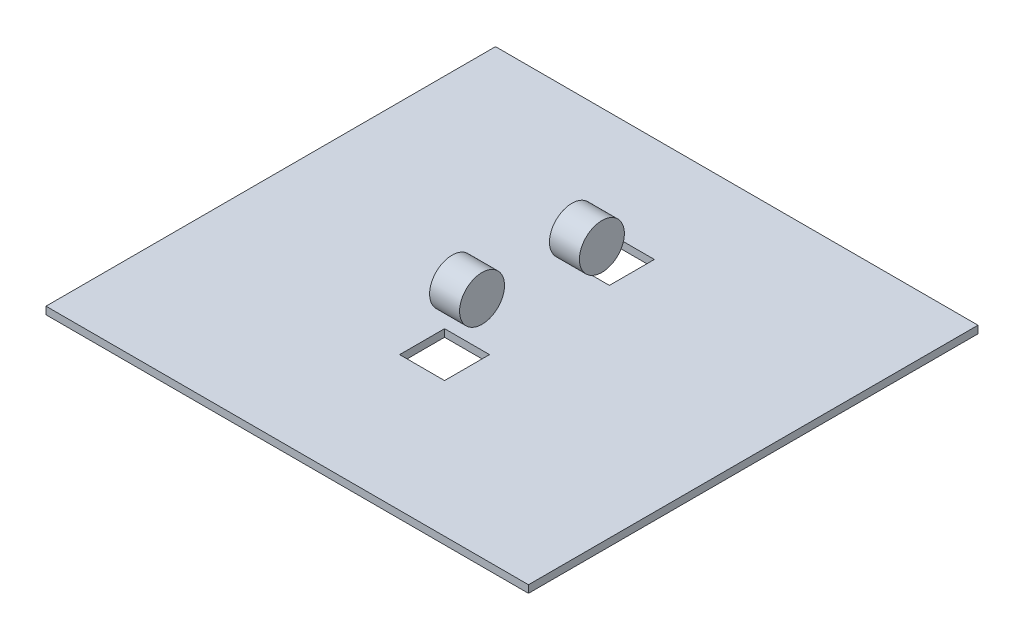
ISO-10303-21;
HEADER;
FILE_DESCRIPTION(('STEP AP214'),'2;1');
FILE_NAME('part.step','',(''),(''),'','','');
FILE_SCHEMA(('AUTOMOTIVE_DESIGN { 1 0 10303 214 1 1 1 1 }'));
ENDSEC;
DATA;
#1=APPLICATION_CONTEXT('core data for automotive mechanical design processes');
#2=APPLICATION_PROTOCOL_DEFINITION('international standard','automotive_design',2000,#1);
#3=PRODUCT_CONTEXT('',#1,'mechanical');
#4=PRODUCT('Part','Part','',(#3));
#5=PRODUCT_RELATED_PRODUCT_CATEGORY('part','',(#4));
#6=PRODUCT_DEFINITION_FORMATION('','',#4);
#7=PRODUCT_DEFINITION_CONTEXT('part definition',#1,'design');
#8=PRODUCT_DEFINITION('design','',#6,#7);
#9=PRODUCT_DEFINITION_SHAPE('','',#8);
#10=(LENGTH_UNIT() NAMED_UNIT(*) SI_UNIT(.MILLI.,.METRE.));
#11=(NAMED_UNIT(*) PLANE_ANGLE_UNIT() SI_UNIT($,.RADIAN.));
#12=(NAMED_UNIT(*) SI_UNIT($,.STERADIAN.) SOLID_ANGLE_UNIT());
#13=UNCERTAINTY_MEASURE_WITH_UNIT(LENGTH_MEASURE(1.E-05),#10,'distance_accuracy_value','');
#14=(GEOMETRIC_REPRESENTATION_CONTEXT(3) GLOBAL_UNCERTAINTY_ASSIGNED_CONTEXT((#13)) GLOBAL_UNIT_ASSIGNED_CONTEXT((#10,
#11,#12)) REPRESENTATION_CONTEXT('',''));
#15=CARTESIAN_POINT('',(0.,0.,0.));
#16=DIRECTION('',(0.,0.,1.));
#17=DIRECTION('',(1.,0.,0.));
#18=AXIS2_PLACEMENT_3D('',#15,#16,#17);
#19=CARTESIAN_POINT('',(171.,25.,-200.));
#20=DIRECTION('',(-1.,0.,0.));
#21=DIRECTION('',(0.,0.,1.));
#22=AXIS2_PLACEMENT_3D('',#19,#20,#21);
#23=CYLINDRICAL_SURFACE('',#22,15.);
#24=CARTESIAN_POINT('',(171.,25.,-200.));
#25=DIRECTION('',(1.,0.,0.));
#26=DIRECTION('',(0.,0.,-1.));
#27=AXIS2_PLACEMENT_3D('',#24,#25,#26);
#28=CIRCLE('',#27,15.);
#29=CARTESIAN_POINT('',(171.,25.,-215.));
#30=VERTEX_POINT('',#29);
#31=EDGE_CURVE('E11',#30,#30,#28,.T.);
#32=ORIENTED_EDGE('',*,*,#31,.F.);
#33=EDGE_LOOP('',(#32));
#34=FACE_BOUND('',#33,.T.);
#35=CARTESIAN_POINT('',(151.,25.,-200.));
#36=DIRECTION('',(1.,0.,0.));
#37=DIRECTION('',(0.,0.,-1.));
#38=AXIS2_PLACEMENT_3D('',#35,#36,#37);
#39=CIRCLE('',#38,15.);
#40=CARTESIAN_POINT('',(151.,25.,-215.));
#41=VERTEX_POINT('',#40);
#42=EDGE_CURVE('E49',#41,#41,#39,.T.);
#43=ORIENTED_EDGE('',*,*,#42,.T.);
#44=EDGE_LOOP('',(#43));
#45=FACE_BOUND('',#44,.T.);
#46=ADVANCED_FACE('F46',(#34,#45),#23,.T.);
#47=CARTESIAN_POINT('',(171.,25.,-200.));
#48=DIRECTION('',(1.,0.,0.));
#49=DIRECTION('',(0.,0.,-1.));
#50=AXIS2_PLACEMENT_3D('',#47,#48,#49);
#51=PLANE('',#50);
#52=ORIENTED_EDGE('',*,*,#31,.T.);
#53=EDGE_LOOP('',(#52));
#54=FACE_BOUND('',#53,.T.);
#55=ADVANCED_FACE('F61',(#54),#51,.T.);
#56=CARTESIAN_POINT('',(151.,25.,-200.));
#57=DIRECTION('',(1.,0.,0.));
#58=DIRECTION('',(0.,0.,-1.));
#59=AXIS2_PLACEMENT_3D('',#56,#57,#58);
#60=PLANE('',#59);
#61=ORIENTED_EDGE('',*,*,#42,.F.);
#62=EDGE_LOOP('',(#61));
#63=FACE_BOUND('',#62,.T.);
#64=ADVANCED_FACE('F59',(#63),#60,.F.);
#65=CLOSED_SHELL('',(#46,#55,#64));
#66=MANIFOLD_SOLID_BREP('B2',#65);
#67=CARTESIAN_POINT('',(171.,35.,-120.));
#68=DIRECTION('',(-1.,0.,0.));
#69=DIRECTION('',(0.,0.,1.));
#70=AXIS2_PLACEMENT_3D('',#67,#68,#69);
#71=CYLINDRICAL_SURFACE('',#70,15.);
#72=CARTESIAN_POINT('',(171.,35.,-120.));
#73=DIRECTION('',(1.,0.,0.));
#74=DIRECTION('',(0.,0.,-1.));
#75=AXIS2_PLACEMENT_3D('',#72,#73,#74);
#76=CIRCLE('',#75,15.);
#77=CARTESIAN_POINT('',(171.,35.,-135.));
#78=VERTEX_POINT('',#77);
#79=EDGE_CURVE('E45',#78,#78,#76,.T.);
#80=ORIENTED_EDGE('',*,*,#79,.F.);
#81=EDGE_LOOP('',(#80));
#82=FACE_BOUND('',#81,.T.);
#83=CARTESIAN_POINT('',(151.,35.,-120.));
#84=DIRECTION('',(1.,0.,0.));
#85=DIRECTION('',(0.,0.,-1.));
#86=AXIS2_PLACEMENT_3D('',#83,#84,#85);
#87=CIRCLE('',#86,15.);
#88=CARTESIAN_POINT('',(151.,35.,-135.));
#89=VERTEX_POINT('',#88);
#90=EDGE_CURVE('E99',#89,#89,#87,.T.);
#91=ORIENTED_EDGE('',*,*,#90,.T.);
#92=EDGE_LOOP('',(#91));
#93=FACE_BOUND('',#92,.T.);
#94=ADVANCED_FACE('F96',(#82,#93),#71,.T.);
#95=CARTESIAN_POINT('',(171.,35.,-120.));
#96=DIRECTION('',(1.,0.,0.));
#97=DIRECTION('',(0.,0.,-1.));
#98=AXIS2_PLACEMENT_3D('',#95,#96,#97);
#99=PLANE('',#98);
#100=ORIENTED_EDGE('',*,*,#79,.T.);
#101=EDGE_LOOP('',(#100));
#102=FACE_BOUND('',#101,.T.);
#103=ADVANCED_FACE('F111',(#102),#99,.T.);
#104=CARTESIAN_POINT('',(151.,35.,-120.));
#105=DIRECTION('',(1.,0.,0.));
#106=DIRECTION('',(0.,0.,-1.));
#107=AXIS2_PLACEMENT_3D('',#104,#105,#106);
#108=PLANE('',#107);
#109=ORIENTED_EDGE('',*,*,#90,.F.);
#110=EDGE_LOOP('',(#109));
#111=FACE_BOUND('',#110,.T.);
#112=ADVANCED_FACE('F109',(#111),#108,.F.);
#113=CLOSED_SHELL('',(#94,#103,#112));
#114=MANIFOLD_SOLID_BREP('B6',#113);
#115=CARTESIAN_POINT('',(0.,5.,0.));
#116=DIRECTION('',(1.,0.,0.));
#117=DIRECTION('',(0.,0.,-1.));
#118=AXIS2_PLACEMENT_3D('',#115,#116,#117);
#119=PLANE('',#118);
#120=DIRECTION('',(0.,0.,1.));
#121=VECTOR('',#120,1.);
#122=CARTESIAN_POINT('',(0.,0.,0.));
#123=LINE('',#122,#121);
#124=CARTESIAN_POINT('',(0.,0.,-300.));
#125=VERTEX_POINT('',#124);
#126=CARTESIAN_POINT('',(0.,0.,0.));
#127=VERTEX_POINT('',#126);
#128=EDGE_CURVE('E275',#125,#127,#123,.T.);
#129=ORIENTED_EDGE('',*,*,#128,.T.);
#130=DIRECTION('',(0.,-1.,0.));
#131=VECTOR('',#130,1.);
#132=CARTESIAN_POINT('',(0.,5.,0.));
#133=LINE('',#132,#131);
#134=CARTESIAN_POINT('',(0.,5.,0.));
#135=VERTEX_POINT('',#134);
#136=EDGE_CURVE('E94',#135,#127,#133,.T.);
#137=ORIENTED_EDGE('',*,*,#136,.F.);
#138=DIRECTION('',(0.,0.,1.));
#139=VECTOR('',#138,1.);
#140=CARTESIAN_POINT('',(0.,5.,0.));
#141=LINE('',#140,#139);
#142=CARTESIAN_POINT('',(0.,5.,-300.));
#143=VERTEX_POINT('',#142);
#144=EDGE_CURVE('E323',#143,#135,#141,.T.);
#145=ORIENTED_EDGE('',*,*,#144,.F.);
#146=DIRECTION('',(0.,-1.,0.));
#147=VECTOR('',#146,1.);
#148=CARTESIAN_POINT('',(0.,5.,-300.));
#149=LINE('',#148,#147);
#150=EDGE_CURVE('E337',#143,#125,#149,.T.);
#151=ORIENTED_EDGE('',*,*,#150,.T.);
#152=EDGE_LOOP('',(#129,#137,#145,#151));
#153=FACE_BOUND('',#152,.T.);
#154=ADVANCED_FACE('F136',(#153),#119,.F.);
#155=CARTESIAN_POINT('',(0.,5.,0.));
#156=DIRECTION('',(0.,0.,-1.));
#157=DIRECTION('',(-1.,0.,0.));
#158=AXIS2_PLACEMENT_3D('',#155,#156,#157);
#159=PLANE('',#158);
#160=DIRECTION('',(1.,0.,0.));
#161=VECTOR('',#160,1.);
#162=CARTESIAN_POINT('',(0.,0.,0.));
#163=LINE('',#162,#161);
#164=CARTESIAN_POINT('',(322.,0.,0.));
#165=VERTEX_POINT('',#164);
#166=EDGE_CURVE('E341',#127,#165,#163,.T.);
#167=ORIENTED_EDGE('',*,*,#166,.T.);
#168=DIRECTION('',(0.,-1.,0.));
#169=VECTOR('',#168,1.);
#170=CARTESIAN_POINT('',(322.,5.,0.));
#171=LINE('',#170,#169);
#172=CARTESIAN_POINT('',(322.,5.,0.));
#173=VERTEX_POINT('',#172);
#174=EDGE_CURVE('E144',#173,#165,#171,.T.);
#175=ORIENTED_EDGE('',*,*,#174,.F.);
#176=DIRECTION('',(1.,0.,0.));
#177=VECTOR('',#176,1.);
#178=CARTESIAN_POINT('',(0.,5.,0.));
#179=LINE('',#178,#177);
#180=EDGE_CURVE('E327',#135,#173,#179,.T.);
#181=ORIENTED_EDGE('',*,*,#180,.F.);
#182=ORIENTED_EDGE('',*,*,#136,.T.);
#183=EDGE_LOOP('',(#167,#175,#181,#182));
#184=FACE_BOUND('',#183,.T.);
#185=ADVANCED_FACE('F376',(#184),#159,.F.);
#186=CARTESIAN_POINT('',(322.,5.,0.));
#187=DIRECTION('',(-1.,0.,0.));
#188=DIRECTION('',(0.,0.,1.));
#189=AXIS2_PLACEMENT_3D('',#186,#187,#188);
#190=PLANE('',#189);
#191=DIRECTION('',(0.,0.,-1.));
#192=VECTOR('',#191,1.);
#193=CARTESIAN_POINT('',(322.,0.,0.));
#194=LINE('',#193,#192);
#195=CARTESIAN_POINT('',(322.,0.,-300.));
#196=VERTEX_POINT('',#195);
#197=EDGE_CURVE('E344',#165,#196,#194,.T.);
#198=ORIENTED_EDGE('',*,*,#197,.T.);
#199=DIRECTION('',(0.,-1.,0.));
#200=VECTOR('',#199,1.);
#201=CARTESIAN_POINT('',(322.,5.,-300.));
#202=LINE('',#201,#200);
#203=CARTESIAN_POINT('',(322.,5.,-300.));
#204=VERTEX_POINT('',#203);
#205=EDGE_CURVE('E352',#204,#196,#202,.T.);
#206=ORIENTED_EDGE('',*,*,#205,.F.);
#207=DIRECTION('',(0.,0.,-1.));
#208=VECTOR('',#207,1.);
#209=CARTESIAN_POINT('',(322.,5.,0.));
#210=LINE('',#209,#208);
#211=EDGE_CURVE('E331',#173,#204,#210,.T.);
#212=ORIENTED_EDGE('',*,*,#211,.F.);
#213=ORIENTED_EDGE('',*,*,#174,.T.);
#214=EDGE_LOOP('',(#198,#206,#212,#213));
#215=FACE_BOUND('',#214,.T.);
#216=ADVANCED_FACE('F361',(#215),#190,.F.);
#217=CARTESIAN_POINT('',(0.,5.,-300.));
#218=DIRECTION('',(0.,0.,1.));
#219=DIRECTION('',(1.,0.,0.));
#220=AXIS2_PLACEMENT_3D('',#217,#218,#219);
#221=PLANE('',#220);
#222=DIRECTION('',(-1.,0.,0.));
#223=VECTOR('',#222,1.);
#224=CARTESIAN_POINT('',(0.,0.,-300.));
#225=LINE('',#224,#223);
#226=EDGE_CURVE('E328',#196,#125,#225,.T.);
#227=ORIENTED_EDGE('',*,*,#226,.T.);
#228=ORIENTED_EDGE('',*,*,#150,.F.);
#229=DIRECTION('',(-1.,0.,0.));
#230=VECTOR('',#229,1.);
#231=CARTESIAN_POINT('',(0.,5.,-300.));
#232=LINE('',#231,#230);
#233=EDGE_CURVE('E334',#204,#143,#232,.T.);
#234=ORIENTED_EDGE('',*,*,#233,.F.);
#235=ORIENTED_EDGE('',*,*,#205,.T.);
#236=EDGE_LOOP('',(#227,#228,#234,#235));
#237=FACE_BOUND('',#236,.T.);
#238=ADVANCED_FACE('F369',(#237),#221,.F.);
#239=CARTESIAN_POINT('',(0.,5.,0.));
#240=DIRECTION('',(0.,-1.,0.));
#241=DIRECTION('',(0.,0.,-1.));
#242=AXIS2_PLACEMENT_3D('',#239,#240,#241);
#243=PLANE('',#242);
#244=DIRECTION('',(1.,0.,0.));
#245=VECTOR('',#244,1.);
#246=CARTESIAN_POINT('',(146.,5.,-90.));
#247=LINE('',#246,#245);
#248=CARTESIAN_POINT('',(146.,5.,-90.));
#249=VERTEX_POINT('',#248);
#250=CARTESIAN_POINT('',(176.,5.,-90.));
#251=VERTEX_POINT('',#250);
#252=EDGE_CURVE('E265',#249,#251,#247,.T.);
#253=ORIENTED_EDGE('',*,*,#252,.F.);
#254=DIRECTION('',(0.,0.,1.));
#255=VECTOR('',#254,1.);
#256=CARTESIAN_POINT('',(146.,5.,-90.));
#257=LINE('',#256,#255);
#258=CARTESIAN_POINT('',(146.,5.,-120.));
#259=VERTEX_POINT('',#258);
#260=EDGE_CURVE('E151',#259,#249,#257,.T.);
#261=ORIENTED_EDGE('',*,*,#260,.F.);
#262=DIRECTION('',(-1.,0.,0.));
#263=VECTOR('',#262,1.);
#264=CARTESIAN_POINT('',(146.,5.,-120.));
#265=LINE('',#264,#263);
#266=CARTESIAN_POINT('',(176.,5.,-120.));
#267=VERTEX_POINT('',#266);
#268=EDGE_CURVE('E249',#267,#259,#265,.T.);
#269=ORIENTED_EDGE('',*,*,#268,.F.);
#270=DIRECTION('',(0.,0.,-1.));
#271=VECTOR('',#270,1.);
#272=CARTESIAN_POINT('',(176.,5.,-90.));
#273=LINE('',#272,#271);
#274=EDGE_CURVE('E253',#251,#267,#273,.T.);
#275=ORIENTED_EDGE('',*,*,#274,.F.);
#276=EDGE_LOOP('',(#253,#261,#269,#275));
#277=FACE_BOUND('',#276,.T.);
#278=DIRECTION('',(1.,0.,0.));
#279=VECTOR('',#278,1.);
#280=CARTESIAN_POINT('',(146.,5.,-200.));
#281=LINE('',#280,#279);
#282=CARTESIAN_POINT('',(146.,5.,-200.));
#283=VERTEX_POINT('',#282);
#284=CARTESIAN_POINT('',(176.,5.,-200.));
#285=VERTEX_POINT('',#284);
#286=EDGE_CURVE('E301',#283,#285,#281,.T.);
#287=ORIENTED_EDGE('',*,*,#286,.F.);
#288=DIRECTION('',(0.,0.,1.));
#289=VECTOR('',#288,1.);
#290=CARTESIAN_POINT('',(146.,5.,-200.));
#291=LINE('',#290,#289);
#292=CARTESIAN_POINT('',(146.,5.,-230.));
#293=VERTEX_POINT('',#292);
#294=EDGE_CURVE('E159',#293,#283,#291,.T.);
#295=ORIENTED_EDGE('',*,*,#294,.F.);
#296=DIRECTION('',(-1.,0.,0.));
#297=VECTOR('',#296,1.);
#298=CARTESIAN_POINT('',(146.,5.,-230.));
#299=LINE('',#298,#297);
#300=CARTESIAN_POINT('',(176.,5.,-230.));
#301=VERTEX_POINT('',#300);
#302=EDGE_CURVE('E286',#301,#293,#299,.T.);
#303=ORIENTED_EDGE('',*,*,#302,.F.);
#304=DIRECTION('',(0.,0.,-1.));
#305=VECTOR('',#304,1.);
#306=CARTESIAN_POINT('',(176.,5.,-200.));
#307=LINE('',#306,#305);
#308=EDGE_CURVE('E306',#285,#301,#307,.T.);
#309=ORIENTED_EDGE('',*,*,#308,.F.);
#310=EDGE_LOOP('',(#287,#295,#303,#309));
#311=FACE_BOUND('',#310,.T.);
#312=ORIENTED_EDGE('',*,*,#144,.T.);
#313=ORIENTED_EDGE('',*,*,#180,.T.);
#314=ORIENTED_EDGE('',*,*,#211,.T.);
#315=ORIENTED_EDGE('',*,*,#233,.T.);
#316=EDGE_LOOP('',(#312,#313,#314,#315));
#317=FACE_BOUND('',#316,.T.);
#318=ADVANCED_FACE('F375',(#277,#311,#317),#243,.F.);
#319=CARTESIAN_POINT('',(0.,0.,0.));
#320=DIRECTION('',(0.,-1.,0.));
#321=DIRECTION('',(0.,0.,-1.));
#322=AXIS2_PLACEMENT_3D('',#319,#320,#321);
#323=PLANE('',#322);
#324=CARTESIAN_POINT('',(202.,0.,-215.));
#325=DIRECTION('',(0.,-1.,0.));
#326=DIRECTION('',(0.,0.,-1.));
#327=AXIS2_PLACEMENT_3D('',#324,#325,#326);
#328=CIRCLE('',#327,7.50000000000001);
#329=CARTESIAN_POINT('',(202.,0.,-222.5));
#330=VERTEX_POINT('',#329);
#331=EDGE_CURVE('E456',#330,#330,#328,.T.);
#332=ORIENTED_EDGE('',*,*,#331,.F.);
#333=EDGE_LOOP('',(#332));
#334=FACE_BOUND('',#333,.T.);
#335=CARTESIAN_POINT('',(120.,0.,-215.));
#336=DIRECTION('',(0.,-1.,0.));
#337=DIRECTION('',(0.,0.,-1.));
#338=AXIS2_PLACEMENT_3D('',#335,#336,#337);
#339=CIRCLE('',#338,7.50000000000001);
#340=CARTESIAN_POINT('',(120.,0.,-222.5));
#341=VERTEX_POINT('',#340);
#342=EDGE_CURVE('E469',#341,#341,#339,.T.);
#343=ORIENTED_EDGE('',*,*,#342,.F.);
#344=EDGE_LOOP('',(#343));
#345=FACE_BOUND('',#344,.T.);
#346=CARTESIAN_POINT('',(70.,0.,-105.));
#347=DIRECTION('',(0.,-1.,0.));
#348=DIRECTION('',(0.,0.,-1.));
#349=AXIS2_PLACEMENT_3D('',#346,#347,#348);
#350=CIRCLE('',#349,7.50000000000001);
#351=CARTESIAN_POINT('',(70.,0.,-112.5));
#352=VERTEX_POINT('',#351);
#353=EDGE_CURVE('E476',#352,#352,#350,.T.);
#354=ORIENTED_EDGE('',*,*,#353,.F.);
#355=EDGE_LOOP('',(#354));
#356=FACE_BOUND('',#355,.T.);
#357=CARTESIAN_POINT('',(252.,0.,-105.));
#358=DIRECTION('',(0.,-1.,0.));
#359=DIRECTION('',(0.,0.,-1.));
#360=AXIS2_PLACEMENT_3D('',#357,#358,#359);
#361=CIRCLE('',#360,7.50000000000001);
#362=CARTESIAN_POINT('',(252.,0.,-112.5));
#363=VERTEX_POINT('',#362);
#364=EDGE_CURVE('E256',#363,#363,#361,.T.);
#365=ORIENTED_EDGE('',*,*,#364,.F.);
#366=EDGE_LOOP('',(#365));
#367=FACE_BOUND('',#366,.T.);
#368=DIRECTION('',(0.,0.,1.));
#369=VECTOR('',#368,1.);
#370=CARTESIAN_POINT('',(146.,0.,-90.));
#371=LINE('',#370,#369);
#372=CARTESIAN_POINT('',(146.,0.,-120.));
#373=VERTEX_POINT('',#372);
#374=CARTESIAN_POINT('',(146.,0.,-90.));
#375=VERTEX_POINT('',#374);
#376=EDGE_CURVE('E227',#373,#375,#371,.T.);
#377=ORIENTED_EDGE('',*,*,#376,.T.);
#378=DIRECTION('',(1.,0.,0.));
#379=VECTOR('',#378,1.);
#380=CARTESIAN_POINT('',(146.,0.,-90.));
#381=LINE('',#380,#379);
#382=CARTESIAN_POINT('',(176.,0.,-90.));
#383=VERTEX_POINT('',#382);
#384=EDGE_CURVE('E238',#375,#383,#381,.T.);
#385=ORIENTED_EDGE('',*,*,#384,.T.);
#386=DIRECTION('',(0.,0.,-1.));
#387=VECTOR('',#386,1.);
#388=CARTESIAN_POINT('',(176.,0.,-90.));
#389=LINE('',#388,#387);
#390=CARTESIAN_POINT('',(176.,0.,-120.));
#391=VERTEX_POINT('',#390);
#392=EDGE_CURVE('E243',#383,#391,#389,.T.);
#393=ORIENTED_EDGE('',*,*,#392,.T.);
#394=DIRECTION('',(-1.,0.,0.));
#395=VECTOR('',#394,1.);
#396=CARTESIAN_POINT('',(146.,0.,-120.));
#397=LINE('',#396,#395);
#398=EDGE_CURVE('E234',#391,#373,#397,.T.);
#399=ORIENTED_EDGE('',*,*,#398,.T.);
#400=EDGE_LOOP('',(#377,#385,#393,#399));
#401=FACE_BOUND('',#400,.T.);
#402=DIRECTION('',(0.,0.,1.));
#403=VECTOR('',#402,1.);
#404=CARTESIAN_POINT('',(146.,0.,-200.));
#405=LINE('',#404,#403);
#406=CARTESIAN_POINT('',(146.,0.,-230.));
#407=VERTEX_POINT('',#406);
#408=CARTESIAN_POINT('',(146.,0.,-200.));
#409=VERTEX_POINT('',#408);
#410=EDGE_CURVE('E281',#407,#409,#405,.T.);
#411=ORIENTED_EDGE('',*,*,#410,.T.);
#412=DIRECTION('',(1.,0.,0.));
#413=VECTOR('',#412,1.);
#414=CARTESIAN_POINT('',(146.,0.,-200.));
#415=LINE('',#414,#413);
#416=CARTESIAN_POINT('',(176.,0.,-200.));
#417=VERTEX_POINT('',#416);
#418=EDGE_CURVE('E285',#409,#417,#415,.T.);
#419=ORIENTED_EDGE('',*,*,#418,.T.);
#420=DIRECTION('',(0.,0.,-1.));
#421=VECTOR('',#420,1.);
#422=CARTESIAN_POINT('',(176.,0.,-200.));
#423=LINE('',#422,#421);
#424=CARTESIAN_POINT('',(176.,0.,-230.));
#425=VERTEX_POINT('',#424);
#426=EDGE_CURVE('E290',#417,#425,#423,.T.);
#427=ORIENTED_EDGE('',*,*,#426,.T.);
#428=DIRECTION('',(-1.,0.,0.));
#429=VECTOR('',#428,1.);
#430=CARTESIAN_POINT('',(146.,0.,-230.));
#431=LINE('',#430,#429);
#432=EDGE_CURVE('E294',#425,#407,#431,.T.);
#433=ORIENTED_EDGE('',*,*,#432,.T.);
#434=EDGE_LOOP('',(#411,#419,#427,#433));
#435=FACE_BOUND('',#434,.T.);
#436=ORIENTED_EDGE('',*,*,#128,.F.);
#437=ORIENTED_EDGE('',*,*,#226,.F.);
#438=ORIENTED_EDGE('',*,*,#197,.F.);
#439=ORIENTED_EDGE('',*,*,#166,.F.);
#440=EDGE_LOOP('',(#436,#437,#438,#439));
#441=FACE_BOUND('',#440,.T.);
#442=ADVANCED_FACE('F245',(#334,#345,#356,#367,#401,#435,#441),#323,.T.);
#443=CARTESIAN_POINT('',(146.,0.,-200.));
#444=DIRECTION('',(-1.,0.,0.));
#445=DIRECTION('',(0.,0.,1.));
#446=AXIS2_PLACEMENT_3D('',#443,#444,#445);
#447=PLANE('',#446);
#448=ORIENTED_EDGE('',*,*,#294,.T.);
#449=DIRECTION('',(0.,1.,0.));
#450=VECTOR('',#449,1.);
#451=CARTESIAN_POINT('',(146.,0.,-200.));
#452=LINE('',#451,#450);
#453=EDGE_CURVE('E298',#409,#283,#452,.T.);
#454=ORIENTED_EDGE('',*,*,#453,.F.);
#455=ORIENTED_EDGE('',*,*,#410,.F.);
#456=DIRECTION('',(0.,1.,0.));
#457=VECTOR('',#456,1.);
#458=CARTESIAN_POINT('',(146.,0.,-230.));
#459=LINE('',#458,#457);
#460=EDGE_CURVE('E266',#407,#293,#459,.T.);
#461=ORIENTED_EDGE('',*,*,#460,.T.);
#462=EDGE_LOOP('',(#448,#454,#455,#461));
#463=FACE_BOUND('',#462,.T.);
#464=ADVANCED_FACE('F388',(#463),#447,.F.);
#465=CARTESIAN_POINT('',(146.,0.,-230.));
#466=DIRECTION('',(0.,0.,-1.));
#467=DIRECTION('',(-1.,0.,0.));
#468=AXIS2_PLACEMENT_3D('',#465,#466,#467);
#469=PLANE('',#468);
#470=ORIENTED_EDGE('',*,*,#302,.T.);
#471=ORIENTED_EDGE('',*,*,#460,.F.);
#472=ORIENTED_EDGE('',*,*,#432,.F.);
#473=DIRECTION('',(0.,1.,0.));
#474=VECTOR('',#473,1.);
#475=CARTESIAN_POINT('',(176.,0.,-230.));
#476=LINE('',#475,#474);
#477=EDGE_CURVE('E315',#425,#301,#476,.T.);
#478=ORIENTED_EDGE('',*,*,#477,.T.);
#479=EDGE_LOOP('',(#470,#471,#472,#478));
#480=FACE_BOUND('',#479,.T.);
#481=ADVANCED_FACE('F395',(#480),#469,.F.);
#482=CARTESIAN_POINT('',(176.,0.,-200.));
#483=DIRECTION('',(1.,0.,0.));
#484=DIRECTION('',(0.,0.,-1.));
#485=AXIS2_PLACEMENT_3D('',#482,#483,#484);
#486=PLANE('',#485);
#487=ORIENTED_EDGE('',*,*,#308,.T.);
#488=ORIENTED_EDGE('',*,*,#477,.F.);
#489=ORIENTED_EDGE('',*,*,#426,.F.);
#490=DIRECTION('',(0.,1.,0.));
#491=VECTOR('',#490,1.);
#492=CARTESIAN_POINT('',(176.,0.,-200.));
#493=LINE('',#492,#491);
#494=EDGE_CURVE('E318',#417,#285,#493,.T.);
#495=ORIENTED_EDGE('',*,*,#494,.T.);
#496=EDGE_LOOP('',(#487,#488,#489,#495));
#497=FACE_BOUND('',#496,.T.);
#498=ADVANCED_FACE('F399',(#497),#486,.F.);
#499=CARTESIAN_POINT('',(146.,0.,-200.));
#500=DIRECTION('',(0.,0.,1.));
#501=DIRECTION('',(1.,0.,0.));
#502=AXIS2_PLACEMENT_3D('',#499,#500,#501);
#503=PLANE('',#502);
#504=ORIENTED_EDGE('',*,*,#286,.T.);
#505=ORIENTED_EDGE('',*,*,#494,.F.);
#506=ORIENTED_EDGE('',*,*,#418,.F.);
#507=ORIENTED_EDGE('',*,*,#453,.T.);
#508=EDGE_LOOP('',(#504,#505,#506,#507));
#509=FACE_BOUND('',#508,.T.);
#510=ADVANCED_FACE('F396',(#509),#503,.F.);
#511=CARTESIAN_POINT('',(146.,0.,-90.));
#512=DIRECTION('',(-1.,0.,0.));
#513=DIRECTION('',(0.,0.,1.));
#514=AXIS2_PLACEMENT_3D('',#511,#512,#513);
#515=PLANE('',#514);
#516=ORIENTED_EDGE('',*,*,#260,.T.);
#517=DIRECTION('',(0.,1.,0.));
#518=VECTOR('',#517,1.);
#519=CARTESIAN_POINT('',(146.,0.,-90.));
#520=LINE('',#519,#518);
#521=EDGE_CURVE('E223',#375,#249,#520,.T.);
#522=ORIENTED_EDGE('',*,*,#521,.F.);
#523=ORIENTED_EDGE('',*,*,#376,.F.);
#524=DIRECTION('',(0.,1.,0.));
#525=VECTOR('',#524,1.);
#526=CARTESIAN_POINT('',(146.,0.,-120.));
#527=LINE('',#526,#525);
#528=EDGE_CURVE('E272',#373,#259,#527,.T.);
#529=ORIENTED_EDGE('',*,*,#528,.T.);
#530=EDGE_LOOP('',(#516,#522,#523,#529));
#531=FACE_BOUND('',#530,.T.);
#532=ADVANCED_FACE('F225',(#531),#515,.F.);
#533=CARTESIAN_POINT('',(146.,0.,-120.));
#534=DIRECTION('',(0.,0.,-1.));
#535=DIRECTION('',(-1.,0.,0.));
#536=AXIS2_PLACEMENT_3D('',#533,#534,#535);
#537=PLANE('',#536);
#538=ORIENTED_EDGE('',*,*,#268,.T.);
#539=ORIENTED_EDGE('',*,*,#528,.F.);
#540=ORIENTED_EDGE('',*,*,#398,.F.);
#541=DIRECTION('',(0.,1.,0.));
#542=VECTOR('',#541,1.);
#543=CARTESIAN_POINT('',(176.,0.,-120.));
#544=LINE('',#543,#542);
#545=EDGE_CURVE('E276',#391,#267,#544,.T.);
#546=ORIENTED_EDGE('',*,*,#545,.T.);
#547=EDGE_LOOP('',(#538,#539,#540,#546));
#548=FACE_BOUND('',#547,.T.);
#549=ADVANCED_FACE('F409',(#548),#537,.F.);
#550=CARTESIAN_POINT('',(176.,0.,-90.));
#551=DIRECTION('',(1.,0.,0.));
#552=DIRECTION('',(0.,0.,-1.));
#553=AXIS2_PLACEMENT_3D('',#550,#551,#552);
#554=PLANE('',#553);
#555=ORIENTED_EDGE('',*,*,#274,.T.);
#556=ORIENTED_EDGE('',*,*,#545,.F.);
#557=ORIENTED_EDGE('',*,*,#392,.F.);
#558=DIRECTION('',(0.,1.,0.));
#559=VECTOR('',#558,1.);
#560=CARTESIAN_POINT('',(176.,0.,-90.));
#561=LINE('',#560,#559);
#562=EDGE_CURVE('E233',#383,#251,#561,.T.);
#563=ORIENTED_EDGE('',*,*,#562,.T.);
#564=EDGE_LOOP('',(#555,#556,#557,#563));
#565=FACE_BOUND('',#564,.T.);
#566=ADVANCED_FACE('F413',(#565),#554,.F.);
#567=CARTESIAN_POINT('',(146.,0.,-90.));
#568=DIRECTION('',(0.,0.,1.));
#569=DIRECTION('',(1.,0.,0.));
#570=AXIS2_PLACEMENT_3D('',#567,#568,#569);
#571=PLANE('',#570);
#572=ORIENTED_EDGE('',*,*,#252,.T.);
#573=ORIENTED_EDGE('',*,*,#562,.F.);
#574=ORIENTED_EDGE('',*,*,#384,.F.);
#575=ORIENTED_EDGE('',*,*,#521,.T.);
#576=EDGE_LOOP('',(#572,#573,#574,#575));
#577=FACE_BOUND('',#576,.T.);
#578=ADVANCED_FACE('F239',(#577),#571,.F.);
#579=CARTESIAN_POINT('',(252.,2.,-105.));
#580=DIRECTION('',(0.,-1.,0.));
#581=DIRECTION('',(0.,0.,-1.));
#582=AXIS2_PLACEMENT_3D('',#579,#580,#581);
#583=CYLINDRICAL_SURFACE('',#582,7.50000000000001);
#584=CARTESIAN_POINT('',(252.,2.,-105.));
#585=DIRECTION('',(0.,-1.,0.));
#586=DIRECTION('',(0.,0.,-1.));
#587=AXIS2_PLACEMENT_3D('',#584,#585,#586);
#588=CIRCLE('',#587,7.50000000000001);
#589=CARTESIAN_POINT('',(252.,2.,-112.5));
#590=VERTEX_POINT('',#589);
#591=EDGE_CURVE('E461',#590,#590,#588,.T.);
#592=ORIENTED_EDGE('',*,*,#591,.F.);
#593=EDGE_LOOP('',(#592));
#594=FACE_BOUND('',#593,.T.);
#595=ORIENTED_EDGE('',*,*,#364,.T.);
#596=EDGE_LOOP('',(#595));
#597=FACE_BOUND('',#596,.T.);
#598=ADVANCED_FACE('F412',(#594,#597),#583,.F.);
#599=CARTESIAN_POINT('',(0.,2.,0.));
#600=DIRECTION('',(0.,-1.,0.));
#601=DIRECTION('',(0.,0.,-1.));
#602=AXIS2_PLACEMENT_3D('',#599,#600,#601);
#603=PLANE('',#602);
#604=ORIENTED_EDGE('',*,*,#591,.T.);
#605=EDGE_LOOP('',(#604));
#606=FACE_BOUND('',#605,.T.);
#607=ADVANCED_FACE('F422',(#606),#603,.T.);
#608=CARTESIAN_POINT('',(70.,2.,-105.));
#609=DIRECTION('',(0.,-1.,0.));
#610=DIRECTION('',(0.,0.,-1.));
#611=AXIS2_PLACEMENT_3D('',#608,#609,#610);
#612=CYLINDRICAL_SURFACE('',#611,7.50000000000001);
#613=CARTESIAN_POINT('',(70.,2.,-105.));
#614=DIRECTION('',(0.,-1.,0.));
#615=DIRECTION('',(0.,0.,-1.));
#616=AXIS2_PLACEMENT_3D('',#613,#614,#615);
#617=CIRCLE('',#616,7.50000000000001);
#618=CARTESIAN_POINT('',(70.,2.,-112.5));
#619=VERTEX_POINT('',#618);
#620=EDGE_CURVE('E302',#619,#619,#617,.T.);
#621=ORIENTED_EDGE('',*,*,#620,.F.);
#622=EDGE_LOOP('',(#621));
#623=FACE_BOUND('',#622,.T.);
#624=ORIENTED_EDGE('',*,*,#353,.T.);
#625=EDGE_LOOP('',(#624));
#626=FACE_BOUND('',#625,.T.);
#627=ADVANCED_FACE('F426',(#623,#626),#612,.F.);
#628=CARTESIAN_POINT('',(0.,2.,0.));
#629=DIRECTION('',(0.,-1.,0.));
#630=DIRECTION('',(0.,0.,-1.));
#631=AXIS2_PLACEMENT_3D('',#628,#629,#630);
#632=PLANE('',#631);
#633=ORIENTED_EDGE('',*,*,#620,.T.);
#634=EDGE_LOOP('',(#633));
#635=FACE_BOUND('',#634,.T.);
#636=ADVANCED_FACE('F430',(#635),#632,.T.);
#637=CARTESIAN_POINT('',(120.,2.,-215.));
#638=DIRECTION('',(0.,-1.,0.));
#639=DIRECTION('',(0.,0.,-1.));
#640=AXIS2_PLACEMENT_3D('',#637,#638,#639);
#641=CYLINDRICAL_SURFACE('',#640,7.50000000000001);
#642=CARTESIAN_POINT('',(120.,2.,-215.));
#643=DIRECTION('',(0.,-1.,0.));
#644=DIRECTION('',(0.,0.,-1.));
#645=AXIS2_PLACEMENT_3D('',#642,#643,#644);
#646=CIRCLE('',#645,7.50000000000001);
#647=CARTESIAN_POINT('',(120.,2.,-222.5));
#648=VERTEX_POINT('',#647);
#649=EDGE_CURVE('E463',#648,#648,#646,.T.);
#650=ORIENTED_EDGE('',*,*,#649,.F.);
#651=EDGE_LOOP('',(#650));
#652=FACE_BOUND('',#651,.T.);
#653=ORIENTED_EDGE('',*,*,#342,.T.);
#654=EDGE_LOOP('',(#653));
#655=FACE_BOUND('',#654,.T.);
#656=ADVANCED_FACE('F434',(#652,#655),#641,.F.);
#657=CARTESIAN_POINT('',(0.,2.,0.));
#658=DIRECTION('',(0.,-1.,0.));
#659=DIRECTION('',(0.,0.,-1.));
#660=AXIS2_PLACEMENT_3D('',#657,#658,#659);
#661=PLANE('',#660);
#662=ORIENTED_EDGE('',*,*,#649,.T.);
#663=EDGE_LOOP('',(#662));
#664=FACE_BOUND('',#663,.T.);
#665=ADVANCED_FACE('F438',(#664),#661,.T.);
#666=CARTESIAN_POINT('',(202.,2.,-215.));
#667=DIRECTION('',(0.,-1.,0.));
#668=DIRECTION('',(0.,0.,-1.));
#669=AXIS2_PLACEMENT_3D('',#666,#667,#668);
#670=CYLINDRICAL_SURFACE('',#669,7.50000000000001);
#671=CARTESIAN_POINT('',(202.,2.,-215.));
#672=DIRECTION('',(0.,-1.,0.));
#673=DIRECTION('',(0.,0.,-1.));
#674=AXIS2_PLACEMENT_3D('',#671,#672,#673);
#675=CIRCLE('',#674,7.50000000000001);
#676=CARTESIAN_POINT('',(202.,2.,-222.5));
#677=VERTEX_POINT('',#676);
#678=EDGE_CURVE('E454',#677,#677,#675,.T.);
#679=ORIENTED_EDGE('',*,*,#678,.F.);
#680=EDGE_LOOP('',(#679));
#681=FACE_BOUND('',#680,.T.);
#682=ORIENTED_EDGE('',*,*,#331,.T.);
#683=EDGE_LOOP('',(#682));
#684=FACE_BOUND('',#683,.T.);
#685=ADVANCED_FACE('F442',(#681,#684),#670,.F.);
#686=CARTESIAN_POINT('',(0.,2.,0.));
#687=DIRECTION('',(0.,-1.,0.));
#688=DIRECTION('',(0.,0.,-1.));
#689=AXIS2_PLACEMENT_3D('',#686,#687,#688);
#690=PLANE('',#689);
#691=ORIENTED_EDGE('',*,*,#678,.T.);
#692=EDGE_LOOP('',(#691));
#693=FACE_BOUND('',#692,.T.);
#694=ADVANCED_FACE('F446',(#693),#690,.T.);
#695=CLOSED_SHELL('',(#154,#185,#216,#238,#318,#442,#464,#481,#498,#510,#532,#549,#566,#578,
#598,#607,#627,#636,#656,#665,#685,#694));
#696=MANIFOLD_SOLID_BREP('B40',#695);
#697=ADVANCED_BREP_SHAPE_REPRESENTATION('',(#18,#66,#114,#696),#14);
#698=SHAPE_DEFINITION_REPRESENTATION(#9,#697);
ENDSEC;
END-ISO-10303-21;
